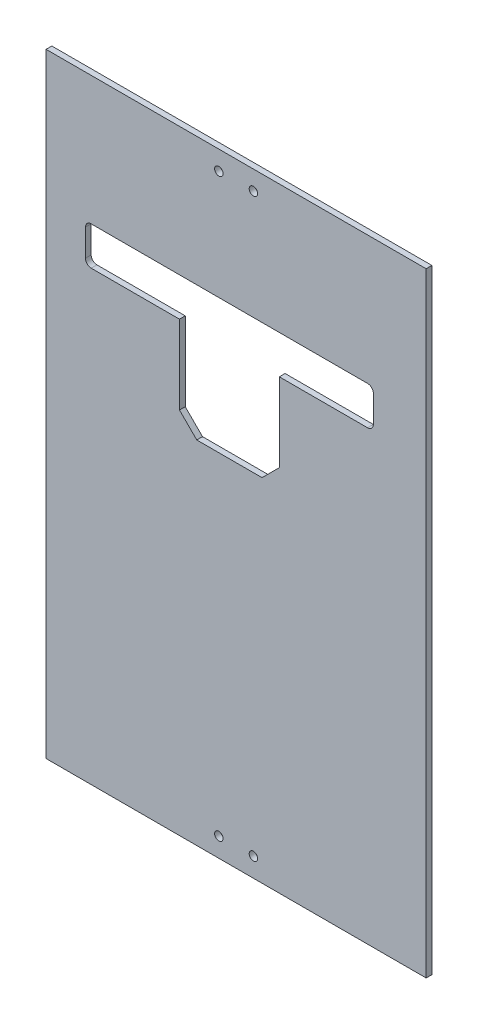
ISO-10303-21;
HEADER;
FILE_DESCRIPTION(('STEP AP214'),'2;1');
FILE_NAME('part.step','',(''),(''),'','','');
FILE_SCHEMA(('AUTOMOTIVE_DESIGN { 1 0 10303 214 1 1 1 1 }'));
ENDSEC;
DATA;
#1=APPLICATION_CONTEXT('core data for automotive mechanical design processes');
#2=APPLICATION_PROTOCOL_DEFINITION('international standard','automotive_design',2000,#1);
#3=PRODUCT_CONTEXT('',#1,'mechanical');
#4=PRODUCT('Part','Part','',(#3));
#5=PRODUCT_RELATED_PRODUCT_CATEGORY('part','',(#4));
#6=PRODUCT_DEFINITION_FORMATION('','',#4);
#7=PRODUCT_DEFINITION_CONTEXT('part definition',#1,'design');
#8=PRODUCT_DEFINITION('design','',#6,#7);
#9=PRODUCT_DEFINITION_SHAPE('','',#8);
#10=(LENGTH_UNIT() NAMED_UNIT(*) SI_UNIT(.MILLI.,.METRE.));
#11=(NAMED_UNIT(*) PLANE_ANGLE_UNIT() SI_UNIT($,.RADIAN.));
#12=(NAMED_UNIT(*) SI_UNIT($,.STERADIAN.) SOLID_ANGLE_UNIT());
#13=UNCERTAINTY_MEASURE_WITH_UNIT(LENGTH_MEASURE(1.E-05),#10,'distance_accuracy_value','');
#14=(GEOMETRIC_REPRESENTATION_CONTEXT(3) GLOBAL_UNCERTAINTY_ASSIGNED_CONTEXT((#13)) GLOBAL_UNIT_ASSIGNED_CONTEXT((#10,
#11,#12)) REPRESENTATION_CONTEXT('',''));
#15=CARTESIAN_POINT('',(0.,0.,0.));
#16=DIRECTION('',(0.,0.,1.));
#17=DIRECTION('',(1.,0.,0.));
#18=AXIS2_PLACEMENT_3D('',#15,#16,#17);
#19=CARTESIAN_POINT('',(-58.5,78.,-0.00100000000000013));
#20=DIRECTION('',(0.,-1.,0.));
#21=DIRECTION('',(1.,0.,0.));
#22=AXIS2_PLACEMENT_3D('',#19,#20,#21);
#23=PLANE('',#22);
#24=DIRECTION('',(1.,0.,0.));
#25=VECTOR('',#24,1.);
#26=CARTESIAN_POINT('',(-58.5,78.,3.));
#27=LINE('',#26,#25);
#28=CARTESIAN_POINT('',(-75.5,78.0000000000001,3.));
#29=VERTEX_POINT('',#28);
#30=CARTESIAN_POINT('',(-29.5,78.,3.));
#31=VERTEX_POINT('',#30);
#32=EDGE_CURVE('E185',#29,#31,#27,.T.);
#33=ORIENTED_EDGE('',*,*,#32,.T.);
#34=DIRECTION('',(0.,0.,1.));
#35=VECTOR('',#34,1.);
#36=CARTESIAN_POINT('',(-29.5,78.,-0.00100000000000013));
#37=LINE('',#36,#35);
#38=CARTESIAN_POINT('',(-29.5,78.,0.));
#39=VERTEX_POINT('',#38);
#40=EDGE_CURVE('E169',#39,#31,#37,.T.);
#41=ORIENTED_EDGE('',*,*,#40,.F.);
#42=DIRECTION('',(1.,0.,0.));
#43=VECTOR('',#42,1.);
#44=CARTESIAN_POINT('',(-58.5,78.,0.));
#45=LINE('',#44,#43);
#46=CARTESIAN_POINT('',(-75.5,78.0000000000001,0.));
#47=VERTEX_POINT('',#46);
#48=EDGE_CURVE('E182',#47,#39,#45,.T.);
#49=ORIENTED_EDGE('',*,*,#48,.F.);
#50=DIRECTION('',(0.,0.,1.));
#51=VECTOR('',#50,1.);
#52=CARTESIAN_POINT('',(-75.5,78.0000000000001,3.));
#53=LINE('',#52,#51);
#54=EDGE_CURVE('E274',#47,#29,#53,.T.);
#55=ORIENTED_EDGE('',*,*,#54,.T.);
#56=EDGE_LOOP('',(#33,#41,#49,#55));
#57=FACE_BOUND('',#56,.T.);
#58=ADVANCED_FACE('F39',(#57),#23,.F.);
#59=CARTESIAN_POINT('',(0.,0.,3.));
#60=DIRECTION('',(0.,0.,-1.));
#61=DIRECTION('',(-1.,0.,0.));
#62=AXIS2_PLACEMENT_3D('',#59,#60,#61);
#63=PLANE('',#62);
#64=DIRECTION('',(0.,-1.,0.));
#65=VECTOR('',#64,1.);
#66=CARTESIAN_POINT('',(-99.,165.,3.));
#67=LINE('',#66,#65);
#68=CARTESIAN_POINT('',(-99.,165.,3.));
#69=VERTEX_POINT('',#68);
#70=CARTESIAN_POINT('',(-99.,-155.,3.));
#71=VERTEX_POINT('',#70);
#72=EDGE_CURVE('E233',#69,#71,#67,.T.);
#73=ORIENTED_EDGE('',*,*,#72,.T.);
#74=DIRECTION('',(1.,0.,0.));
#75=VECTOR('',#74,1.);
#76=CARTESIAN_POINT('',(99.,-155.,3.));
#77=LINE('',#76,#75);
#78=CARTESIAN_POINT('',(99.,-155.,3.));
#79=VERTEX_POINT('',#78);
#80=EDGE_CURVE('E236',#71,#79,#77,.T.);
#81=ORIENTED_EDGE('',*,*,#80,.T.);
#82=DIRECTION('',(0.,1.,0.));
#83=VECTOR('',#82,1.);
#84=CARTESIAN_POINT('',(99.,165.,3.));
#85=LINE('',#84,#83);
#86=CARTESIAN_POINT('',(99.,165.,3.));
#87=VERTEX_POINT('',#86);
#88=EDGE_CURVE('E239',#79,#87,#85,.T.);
#89=ORIENTED_EDGE('',*,*,#88,.T.);
#90=DIRECTION('',(-1.,0.,0.));
#91=VECTOR('',#90,1.);
#92=CARTESIAN_POINT('',(-99.,165.,3.));
#93=LINE('',#92,#91);
#94=EDGE_CURVE('E241',#87,#69,#93,.T.);
#95=ORIENTED_EDGE('',*,*,#94,.T.);
#96=EDGE_LOOP('',(#73,#81,#89,#95));
#97=FACE_BOUND('',#96,.T.);
#98=CARTESIAN_POINT('',(9.,-145.,3.));
#99=DIRECTION('',(0.,0.,1.));
#100=DIRECTION('',(1.,0.,0.));
#101=AXIS2_PLACEMENT_3D('',#98,#99,#100);
#102=CIRCLE('',#101,2.2);
#103=CARTESIAN_POINT('',(11.2,-145.,3.));
#104=VERTEX_POINT('',#103);
#105=EDGE_CURVE('E227',#104,#104,#102,.T.);
#106=ORIENTED_EDGE('',*,*,#105,.F.);
#107=EDGE_LOOP('',(#106));
#108=FACE_BOUND('',#107,.T.);
#109=CARTESIAN_POINT('',(-9.,-145.,3.));
#110=DIRECTION('',(0.,0.,1.));
#111=DIRECTION('',(1.,0.,0.));
#112=AXIS2_PLACEMENT_3D('',#109,#110,#111);
#113=CIRCLE('',#112,2.2);
#114=CARTESIAN_POINT('',(-6.8,-145.,3.));
#115=VERTEX_POINT('',#114);
#116=EDGE_CURVE('E209',#115,#115,#113,.T.);
#117=ORIENTED_EDGE('',*,*,#116,.F.);
#118=EDGE_LOOP('',(#117));
#119=FACE_BOUND('',#118,.T.);
#120=CARTESIAN_POINT('',(-9.,155.,3.));
#121=DIRECTION('',(0.,0.,1.));
#122=DIRECTION('',(1.,0.,0.));
#123=AXIS2_PLACEMENT_3D('',#120,#121,#122);
#124=CIRCLE('',#123,2.2);
#125=CARTESIAN_POINT('',(-6.8,155.,3.));
#126=VERTEX_POINT('',#125);
#127=EDGE_CURVE('E216',#126,#126,#124,.T.);
#128=ORIENTED_EDGE('',*,*,#127,.F.);
#129=EDGE_LOOP('',(#128));
#130=FACE_BOUND('',#129,.T.);
#131=CARTESIAN_POINT('',(9.,155.,3.));
#132=DIRECTION('',(0.,0.,1.));
#133=DIRECTION('',(1.,0.,0.));
#134=AXIS2_PLACEMENT_3D('',#131,#132,#133);
#135=CIRCLE('',#134,2.2);
#136=CARTESIAN_POINT('',(11.2,155.,3.));
#137=VERTEX_POINT('',#136);
#138=EDGE_CURVE('E222',#137,#137,#135,.T.);
#139=ORIENTED_EDGE('',*,*,#138,.F.);
#140=EDGE_LOOP('',(#139));
#141=FACE_BOUND('',#140,.T.);
#142=DIRECTION('',(0.707106781186548,-0.707106781186547,0.));
#143=VECTOR('',#142,1.);
#144=CARTESIAN_POINT('',(-20.5,28.0000000000001,3.));
#145=LINE('',#144,#143);
#146=CARTESIAN_POINT('',(-29.5,37.,3.));
#147=VERTEX_POINT('',#146);
#148=CARTESIAN_POINT('',(-20.5,28.0000000000001,3.));
#149=VERTEX_POINT('',#148);
#150=EDGE_CURVE('E322',#147,#149,#145,.T.);
#151=ORIENTED_EDGE('',*,*,#150,.F.);
#152=DIRECTION('',(0.,-1.,0.));
#153=VECTOR('',#152,1.);
#154=CARTESIAN_POINT('',(-29.5,37.,3.));
#155=LINE('',#154,#153);
#156=EDGE_CURVE('E329',#31,#147,#155,.T.);
#157=ORIENTED_EDGE('',*,*,#156,.F.);
#158=ORIENTED_EDGE('',*,*,#32,.F.);
#159=CARTESIAN_POINT('',(-75.5,81.0000000000001,3.));
#160=DIRECTION('',(0.,0.,-1.));
#161=DIRECTION('',(-1.,0.,0.));
#162=AXIS2_PLACEMENT_3D('',#159,#160,#161);
#163=CIRCLE('',#162,3.);
#164=CARTESIAN_POINT('',(-78.5,81.0000000000001,3.));
#165=VERTEX_POINT('',#164);
#166=EDGE_CURVE('E292',#29,#165,#163,.T.);
#167=ORIENTED_EDGE('',*,*,#166,.T.);
#168=DIRECTION('',(0.,-1.,0.));
#169=VECTOR('',#168,1.);
#170=CARTESIAN_POINT('',(-78.5,78.0000000000001,3.));
#171=LINE('',#170,#169);
#172=CARTESIAN_POINT('',(-78.5,95.0000000000001,3.));
#173=VERTEX_POINT('',#172);
#174=EDGE_CURVE('E196',#173,#165,#171,.T.);
#175=ORIENTED_EDGE('',*,*,#174,.F.);
#176=CARTESIAN_POINT('',(-75.5,95.0000000000001,3.));
#177=DIRECTION('',(0.,0.,-1.));
#178=DIRECTION('',(-1.,0.,0.));
#179=AXIS2_PLACEMENT_3D('',#176,#177,#178);
#180=CIRCLE('',#179,3.);
#181=CARTESIAN_POINT('',(-75.5,98.0000000000001,3.));
#182=VERTEX_POINT('',#181);
#183=EDGE_CURVE('E47',#173,#182,#180,.T.);
#184=ORIENTED_EDGE('',*,*,#183,.T.);
#185=DIRECTION('',(-1.,0.,0.));
#186=VECTOR('',#185,1.);
#187=CARTESIAN_POINT('',(-78.5,98.0000000000001,3.));
#188=LINE('',#187,#186);
#189=CARTESIAN_POINT('',(68.5,98.0000000000001,3.));
#190=VERTEX_POINT('',#189);
#191=EDGE_CURVE('E192',#190,#182,#188,.T.);
#192=ORIENTED_EDGE('',*,*,#191,.F.);
#193=CARTESIAN_POINT('',(68.5,95.0000000000001,3.));
#194=DIRECTION('',(0.,0.,-1.));
#195=DIRECTION('',(-1.,0.,0.));
#196=AXIS2_PLACEMENT_3D('',#193,#194,#195);
#197=CIRCLE('',#196,3.);
#198=CARTESIAN_POINT('',(71.5,95.0000000000001,3.));
#199=VERTEX_POINT('',#198);
#200=EDGE_CURVE('E285',#190,#199,#197,.T.);
#201=ORIENTED_EDGE('',*,*,#200,.T.);
#202=DIRECTION('',(0.,1.,0.));
#203=VECTOR('',#202,1.);
#204=CARTESIAN_POINT('',(71.5,0.,3.));
#205=LINE('',#204,#203);
#206=CARTESIAN_POINT('',(71.5,80.9999999999998,3.));
#207=VERTEX_POINT('',#206);
#208=EDGE_CURVE('E309',#207,#199,#205,.T.);
#209=ORIENTED_EDGE('',*,*,#208,.F.);
#210=CARTESIAN_POINT('',(68.5,80.9999999999998,3.));
#211=DIRECTION('',(0.,0.,-1.));
#212=DIRECTION('',(-1.,0.,0.));
#213=AXIS2_PLACEMENT_3D('',#210,#211,#212);
#214=CIRCLE('',#213,3.);
#215=CARTESIAN_POINT('',(68.5,77.9999999999998,3.));
#216=VERTEX_POINT('',#215);
#217=EDGE_CURVE('E289',#207,#216,#214,.T.);
#218=ORIENTED_EDGE('',*,*,#217,.T.);
#219=CARTESIAN_POINT('',(22.5,77.9999999999999,3.));
#220=VERTEX_POINT('',#219);
#221=EDGE_CURVE('E203',#220,#216,#27,.T.);
#222=ORIENTED_EDGE('',*,*,#221,.F.);
#223=DIRECTION('',(0.,1.,0.));
#224=VECTOR('',#223,1.);
#225=CARTESIAN_POINT('',(22.5,37.0000000000001,3.));
#226=LINE('',#225,#224);
#227=CARTESIAN_POINT('',(22.5,37.0000000000001,3.));
#228=VERTEX_POINT('',#227);
#229=EDGE_CURVE('E54',#228,#220,#226,.T.);
#230=ORIENTED_EDGE('',*,*,#229,.F.);
#231=DIRECTION('',(0.707106781186547,0.707106781186547,0.));
#232=VECTOR('',#231,1.);
#233=CARTESIAN_POINT('',(22.5,37.0000000000001,3.));
#234=LINE('',#233,#232);
#235=CARTESIAN_POINT('',(13.5,28.0000000000001,3.));
#236=VERTEX_POINT('',#235);
#237=EDGE_CURVE('E332',#236,#228,#234,.T.);
#238=ORIENTED_EDGE('',*,*,#237,.F.);
#239=DIRECTION('',(1.,0.,0.));
#240=VECTOR('',#239,1.);
#241=CARTESIAN_POINT('',(-3.49999999999998,28.0000000000001,3.));
#242=LINE('',#241,#240);
#243=EDGE_CURVE('E175',#149,#236,#242,.T.);
#244=ORIENTED_EDGE('',*,*,#243,.F.);
#245=EDGE_LOOP('',(#151,#157,#158,#167,#175,#184,#192,#201,#209,#218,#222,#230,#238,#244));
#246=FACE_BOUND('',#245,.T.);
#247=ADVANCED_FACE('F298',(#97,#108,#119,#130,#141,#246),#63,.F.);
#248=CARTESIAN_POINT('',(0.,0.,0.));
#249=DIRECTION('',(0.,0.,-1.));
#250=DIRECTION('',(-1.,0.,0.));
#251=AXIS2_PLACEMENT_3D('',#248,#249,#250);
#252=PLANE('',#251);
#253=DIRECTION('',(0.,-1.,0.));
#254=VECTOR('',#253,1.);
#255=CARTESIAN_POINT('',(-29.5,37.,0.));
#256=LINE('',#255,#254);
#257=CARTESIAN_POINT('',(-29.5,37.,0.));
#258=VERTEX_POINT('',#257);
#259=EDGE_CURVE('E165',#39,#258,#256,.T.);
#260=ORIENTED_EDGE('',*,*,#259,.T.);
#261=DIRECTION('',(0.707106781186548,-0.707106781186547,0.));
#262=VECTOR('',#261,1.);
#263=CARTESIAN_POINT('',(-20.5,28.0000000000001,0.));
#264=LINE('',#263,#262);
#265=CARTESIAN_POINT('',(-20.5,28.0000000000001,0.));
#266=VERTEX_POINT('',#265);
#267=EDGE_CURVE('E176',#258,#266,#264,.T.);
#268=ORIENTED_EDGE('',*,*,#267,.T.);
#269=DIRECTION('',(1.,0.,0.));
#270=VECTOR('',#269,1.);
#271=CARTESIAN_POINT('',(-3.49999999999998,28.0000000000001,0.));
#272=LINE('',#271,#270);
#273=CARTESIAN_POINT('',(13.5,28.0000000000001,0.));
#274=VERTEX_POINT('',#273);
#275=EDGE_CURVE('E311',#266,#274,#272,.T.);
#276=ORIENTED_EDGE('',*,*,#275,.T.);
#277=DIRECTION('',(0.707106781186548,0.707106781186548,0.));
#278=VECTOR('',#277,1.);
#279=CARTESIAN_POINT('',(22.5,37.0000000000001,0.));
#280=LINE('',#279,#278);
#281=CARTESIAN_POINT('',(22.5,37.0000000000001,0.));
#282=VERTEX_POINT('',#281);
#283=EDGE_CURVE('E341',#274,#282,#280,.T.);
#284=ORIENTED_EDGE('',*,*,#283,.T.);
#285=DIRECTION('',(0.,1.,0.));
#286=VECTOR('',#285,1.);
#287=CARTESIAN_POINT('',(22.5,37.0000000000001,0.));
#288=LINE('',#287,#286);
#289=CARTESIAN_POINT('',(22.5,77.9999999999999,0.));
#290=VERTEX_POINT('',#289);
#291=EDGE_CURVE('E338',#282,#290,#288,.T.);
#292=ORIENTED_EDGE('',*,*,#291,.T.);
#293=CARTESIAN_POINT('',(68.5,77.9999999999998,0.));
#294=VERTEX_POINT('',#293);
#295=EDGE_CURVE('E193',#290,#294,#45,.T.);
#296=ORIENTED_EDGE('',*,*,#295,.T.);
#297=CARTESIAN_POINT('',(68.5,80.9999999999998,0.));
#298=DIRECTION('',(0.,0.,-1.));
#299=DIRECTION('',(-1.,0.,0.));
#300=AXIS2_PLACEMENT_3D('',#297,#298,#299);
#301=CIRCLE('',#300,3.);
#302=CARTESIAN_POINT('',(71.5,80.9999999999998,0.));
#303=VERTEX_POINT('',#302);
#304=EDGE_CURVE('E287',#294,#303,#301,.F.);
#305=ORIENTED_EDGE('',*,*,#304,.T.);
#306=DIRECTION('',(0.,1.,0.));
#307=VECTOR('',#306,1.);
#308=CARTESIAN_POINT('',(71.5,0.,0.));
#309=LINE('',#308,#307);
#310=CARTESIAN_POINT('',(71.5,95.0000000000001,0.));
#311=VERTEX_POINT('',#310);
#312=EDGE_CURVE('E262',#303,#311,#309,.T.);
#313=ORIENTED_EDGE('',*,*,#312,.T.);
#314=CARTESIAN_POINT('',(68.5,95.0000000000001,0.));
#315=DIRECTION('',(0.,0.,-1.));
#316=DIRECTION('',(-1.,0.,0.));
#317=AXIS2_PLACEMENT_3D('',#314,#315,#316);
#318=CIRCLE('',#317,3.);
#319=CARTESIAN_POINT('',(68.5,98.0000000000001,0.));
#320=VERTEX_POINT('',#319);
#321=EDGE_CURVE('E283',#311,#320,#318,.F.);
#322=ORIENTED_EDGE('',*,*,#321,.T.);
#323=DIRECTION('',(-1.,0.,0.));
#324=VECTOR('',#323,1.);
#325=CARTESIAN_POINT('',(-78.5,98.0000000000001,0.));
#326=LINE('',#325,#324);
#327=CARTESIAN_POINT('',(-75.5,98.0000000000001,0.));
#328=VERTEX_POINT('',#327);
#329=EDGE_CURVE('E205',#320,#328,#326,.T.);
#330=ORIENTED_EDGE('',*,*,#329,.T.);
#331=CARTESIAN_POINT('',(-75.5,95.0000000000001,0.));
#332=DIRECTION('',(0.,0.,-1.));
#333=DIRECTION('',(-1.,0.,0.));
#334=AXIS2_PLACEMENT_3D('',#331,#332,#333);
#335=CIRCLE('',#334,3.);
#336=CARTESIAN_POINT('',(-78.5,95.0000000000001,0.));
#337=VERTEX_POINT('',#336);
#338=EDGE_CURVE('E11',#328,#337,#335,.F.);
#339=ORIENTED_EDGE('',*,*,#338,.T.);
#340=DIRECTION('',(0.,-1.,0.));
#341=VECTOR('',#340,1.);
#342=CARTESIAN_POINT('',(-78.5,78.0000000000001,0.));
#343=LINE('',#342,#341);
#344=CARTESIAN_POINT('',(-78.5,81.0000000000001,0.));
#345=VERTEX_POINT('',#344);
#346=EDGE_CURVE('E198',#337,#345,#343,.T.);
#347=ORIENTED_EDGE('',*,*,#346,.T.);
#348=CARTESIAN_POINT('',(-75.5,81.0000000000001,0.));
#349=DIRECTION('',(0.,0.,-1.));
#350=DIRECTION('',(-1.,0.,0.));
#351=AXIS2_PLACEMENT_3D('',#348,#349,#350);
#352=CIRCLE('',#351,3.);
#353=EDGE_CURVE('E191',#345,#47,#352,.F.);
#354=ORIENTED_EDGE('',*,*,#353,.T.);
#355=ORIENTED_EDGE('',*,*,#48,.T.);
#356=EDGE_LOOP('',(#260,#268,#276,#284,#292,#296,#305,#313,#322,#330,#339,#347,#354,#355));
#357=FACE_BOUND('',#356,.T.);
#358=CARTESIAN_POINT('',(9.,155.,0.));
#359=DIRECTION('',(0.,0.,-1.));
#360=DIRECTION('',(-1.,0.,0.));
#361=AXIS2_PLACEMENT_3D('',#358,#359,#360);
#362=CIRCLE('',#361,2.2);
#363=CARTESIAN_POINT('',(11.2,155.,0.));
#364=VERTEX_POINT('',#363);
#365=EDGE_CURVE('E208',#364,#364,#362,.F.);
#366=ORIENTED_EDGE('',*,*,#365,.T.);
#367=EDGE_LOOP('',(#366));
#368=FACE_BOUND('',#367,.T.);
#369=CARTESIAN_POINT('',(-9.,155.,0.));
#370=DIRECTION('',(0.,0.,-1.));
#371=DIRECTION('',(-1.,0.,0.));
#372=AXIS2_PLACEMENT_3D('',#369,#370,#371);
#373=CIRCLE('',#372,2.2);
#374=CARTESIAN_POINT('',(-6.8,155.,0.));
#375=VERTEX_POINT('',#374);
#376=EDGE_CURVE('E219',#375,#375,#373,.F.);
#377=ORIENTED_EDGE('',*,*,#376,.T.);
#378=EDGE_LOOP('',(#377));
#379=FACE_BOUND('',#378,.T.);
#380=CARTESIAN_POINT('',(-9.,-145.,0.));
#381=DIRECTION('',(0.,0.,-1.));
#382=DIRECTION('',(-1.,0.,0.));
#383=AXIS2_PLACEMENT_3D('',#380,#381,#382);
#384=CIRCLE('',#383,2.2);
#385=CARTESIAN_POINT('',(-6.8,-145.,0.));
#386=VERTEX_POINT('',#385);
#387=EDGE_CURVE('E213',#386,#386,#384,.F.);
#388=ORIENTED_EDGE('',*,*,#387,.T.);
#389=EDGE_LOOP('',(#388));
#390=FACE_BOUND('',#389,.T.);
#391=CARTESIAN_POINT('',(9.,-145.,0.));
#392=DIRECTION('',(0.,0.,-1.));
#393=DIRECTION('',(-1.,0.,0.));
#394=AXIS2_PLACEMENT_3D('',#391,#392,#393);
#395=CIRCLE('',#394,2.2);
#396=CARTESIAN_POINT('',(11.2,-145.,0.));
#397=VERTEX_POINT('',#396);
#398=EDGE_CURVE('E212',#397,#397,#395,.F.);
#399=ORIENTED_EDGE('',*,*,#398,.T.);
#400=EDGE_LOOP('',(#399));
#401=FACE_BOUND('',#400,.T.);
#402=DIRECTION('',(0.,-1.,0.));
#403=VECTOR('',#402,1.);
#404=CARTESIAN_POINT('',(-99.,165.,0.));
#405=LINE('',#404,#403);
#406=CARTESIAN_POINT('',(-99.,165.,0.));
#407=VERTEX_POINT('',#406);
#408=CARTESIAN_POINT('',(-99.,-155.,0.));
#409=VERTEX_POINT('',#408);
#410=EDGE_CURVE('E230',#407,#409,#405,.T.);
#411=ORIENTED_EDGE('',*,*,#410,.F.);
#412=DIRECTION('',(-1.,0.,0.));
#413=VECTOR('',#412,1.);
#414=CARTESIAN_POINT('',(-99.,165.,0.));
#415=LINE('',#414,#413);
#416=CARTESIAN_POINT('',(99.,165.,0.));
#417=VERTEX_POINT('',#416);
#418=EDGE_CURVE('E237',#417,#407,#415,.T.);
#419=ORIENTED_EDGE('',*,*,#418,.F.);
#420=DIRECTION('',(0.,1.,0.));
#421=VECTOR('',#420,1.);
#422=CARTESIAN_POINT('',(99.,165.,0.));
#423=LINE('',#422,#421);
#424=CARTESIAN_POINT('',(99.,-155.,0.));
#425=VERTEX_POINT('',#424);
#426=EDGE_CURVE('E248',#425,#417,#423,.T.);
#427=ORIENTED_EDGE('',*,*,#426,.F.);
#428=DIRECTION('',(1.,0.,0.));
#429=VECTOR('',#428,1.);
#430=CARTESIAN_POINT('',(99.,-155.,0.));
#431=LINE('',#430,#429);
#432=EDGE_CURVE('E246',#409,#425,#431,.T.);
#433=ORIENTED_EDGE('',*,*,#432,.F.);
#434=EDGE_LOOP('',(#411,#419,#427,#433));
#435=FACE_BOUND('',#434,.T.);
#436=ADVANCED_FACE('F188',(#357,#368,#379,#390,#401,#435),#252,.T.);
#437=CARTESIAN_POINT('',(-99.,165.,3.));
#438=DIRECTION('',(1.,0.,0.));
#439=DIRECTION('',(0.,1.,0.));
#440=AXIS2_PLACEMENT_3D('',#437,#438,#439);
#441=PLANE('',#440);
#442=ORIENTED_EDGE('',*,*,#410,.T.);
#443=DIRECTION('',(0.,0.,-1.));
#444=VECTOR('',#443,1.);
#445=CARTESIAN_POINT('',(-99.,-155.,3.));
#446=LINE('',#445,#444);
#447=EDGE_CURVE('E259',#71,#409,#446,.T.);
#448=ORIENTED_EDGE('',*,*,#447,.F.);
#449=ORIENTED_EDGE('',*,*,#72,.F.);
#450=DIRECTION('',(0.,0.,-1.));
#451=VECTOR('',#450,1.);
#452=CARTESIAN_POINT('',(-99.,165.,3.));
#453=LINE('',#452,#451);
#454=EDGE_CURVE('E243',#69,#407,#453,.T.);
#455=ORIENTED_EDGE('',*,*,#454,.T.);
#456=EDGE_LOOP('',(#442,#448,#449,#455));
#457=FACE_BOUND('',#456,.T.);
#458=ADVANCED_FACE('F403',(#457),#441,.F.);
#459=CARTESIAN_POINT('',(99.,-155.,3.));
#460=DIRECTION('',(0.,1.,0.));
#461=DIRECTION('',(-1.,0.,0.));
#462=AXIS2_PLACEMENT_3D('',#459,#460,#461);
#463=PLANE('',#462);
#464=ORIENTED_EDGE('',*,*,#432,.T.);
#465=DIRECTION('',(0.,0.,-1.));
#466=VECTOR('',#465,1.);
#467=CARTESIAN_POINT('',(99.,-155.,3.));
#468=LINE('',#467,#466);
#469=EDGE_CURVE('E256',#79,#425,#468,.T.);
#470=ORIENTED_EDGE('',*,*,#469,.F.);
#471=ORIENTED_EDGE('',*,*,#80,.F.);
#472=ORIENTED_EDGE('',*,*,#447,.T.);
#473=EDGE_LOOP('',(#464,#470,#471,#472));
#474=FACE_BOUND('',#473,.T.);
#475=ADVANCED_FACE('F410',(#474),#463,.F.);
#476=CARTESIAN_POINT('',(99.,165.,3.));
#477=DIRECTION('',(-1.,0.,0.));
#478=DIRECTION('',(0.,-1.,0.));
#479=AXIS2_PLACEMENT_3D('',#476,#477,#478);
#480=PLANE('',#479);
#481=ORIENTED_EDGE('',*,*,#426,.T.);
#482=DIRECTION('',(0.,0.,-1.));
#483=VECTOR('',#482,1.);
#484=CARTESIAN_POINT('',(99.,165.,3.));
#485=LINE('',#484,#483);
#486=EDGE_CURVE('E253',#87,#417,#485,.T.);
#487=ORIENTED_EDGE('',*,*,#486,.F.);
#488=ORIENTED_EDGE('',*,*,#88,.F.);
#489=ORIENTED_EDGE('',*,*,#469,.T.);
#490=EDGE_LOOP('',(#481,#487,#488,#489));
#491=FACE_BOUND('',#490,.T.);
#492=ADVANCED_FACE('F406',(#491),#480,.F.);
#493=CARTESIAN_POINT('',(-99.,165.,3.));
#494=DIRECTION('',(0.,-1.,0.));
#495=DIRECTION('',(0.,0.,-1.));
#496=AXIS2_PLACEMENT_3D('',#493,#494,#495);
#497=PLANE('',#496);
#498=ORIENTED_EDGE('',*,*,#418,.T.);
#499=ORIENTED_EDGE('',*,*,#454,.F.);
#500=ORIENTED_EDGE('',*,*,#94,.F.);
#501=ORIENTED_EDGE('',*,*,#486,.T.);
#502=EDGE_LOOP('',(#498,#499,#500,#501));
#503=FACE_BOUND('',#502,.T.);
#504=ADVANCED_FACE('F398',(#503),#497,.F.);
#505=CARTESIAN_POINT('',(9.,-145.,-0.00100000000000013));
#506=DIRECTION('',(0.,0.,1.));
#507=DIRECTION('',(1.,0.,0.));
#508=AXIS2_PLACEMENT_3D('',#505,#506,#507);
#509=CYLINDRICAL_SURFACE('',#508,2.2);
#510=CARTESIAN_POINT('',(11.2,-145.,0.));
#511=CARTESIAN_POINT('',(11.2,-145.,0.03125));
#512=CARTESIAN_POINT('',(11.2,-145.,0.0625));
#513=CARTESIAN_POINT('',(11.2,-145.,0.125));
#514=CARTESIAN_POINT('',(11.2,-145.,0.15625));
#515=CARTESIAN_POINT('',(11.2,-145.,0.21875));
#516=CARTESIAN_POINT('',(11.2,-145.,0.25));
#517=CARTESIAN_POINT('',(11.2,-145.,0.3125));
#518=CARTESIAN_POINT('',(11.2,-145.,0.34375));
#519=CARTESIAN_POINT('',(11.2,-145.,0.40625));
#520=CARTESIAN_POINT('',(11.2,-145.,0.4375));
#521=CARTESIAN_POINT('',(11.2,-145.,0.5));
#522=CARTESIAN_POINT('',(11.2,-145.,0.53125));
#523=CARTESIAN_POINT('',(11.2,-145.,0.59375));
#524=CARTESIAN_POINT('',(11.2,-145.,0.625));
#525=CARTESIAN_POINT('',(11.2,-145.,0.6875));
#526=CARTESIAN_POINT('',(11.2,-145.,0.71875));
#527=CARTESIAN_POINT('',(11.2,-145.,0.78125));
#528=CARTESIAN_POINT('',(11.2,-145.,0.8125));
#529=CARTESIAN_POINT('',(11.2,-145.,0.875));
#530=CARTESIAN_POINT('',(11.2,-145.,0.90625));
#531=CARTESIAN_POINT('',(11.2,-145.,0.96875));
#532=CARTESIAN_POINT('',(11.2,-145.,1.));
#533=CARTESIAN_POINT('',(11.2,-145.,1.0625));
#534=CARTESIAN_POINT('',(11.2,-145.,1.09375));
#535=CARTESIAN_POINT('',(11.2,-145.,1.15625));
#536=CARTESIAN_POINT('',(11.2,-145.,1.1875));
#537=CARTESIAN_POINT('',(11.2,-145.,1.25));
#538=CARTESIAN_POINT('',(11.2,-145.,1.28125));
#539=CARTESIAN_POINT('',(11.2,-145.,1.34375));
#540=CARTESIAN_POINT('',(11.2,-145.,1.375));
#541=CARTESIAN_POINT('',(11.2,-145.,1.4375));
#542=CARTESIAN_POINT('',(11.2,-145.,1.46875));
#543=CARTESIAN_POINT('',(11.2,-145.,1.53125));
#544=CARTESIAN_POINT('',(11.2,-145.,1.5625));
#545=CARTESIAN_POINT('',(11.2,-145.,1.625));
#546=CARTESIAN_POINT('',(11.2,-145.,1.65625));
#547=CARTESIAN_POINT('',(11.2,-145.,1.71875));
#548=CARTESIAN_POINT('',(11.2,-145.,1.75));
#549=CARTESIAN_POINT('',(11.2,-145.,1.8125));
#550=CARTESIAN_POINT('',(11.2,-145.,1.84375));
#551=CARTESIAN_POINT('',(11.2,-145.,1.90625));
#552=CARTESIAN_POINT('',(11.2,-145.,1.9375));
#553=CARTESIAN_POINT('',(11.2,-145.,2.));
#554=CARTESIAN_POINT('',(11.2,-145.,2.03125));
#555=CARTESIAN_POINT('',(11.2,-145.,2.09375));
#556=CARTESIAN_POINT('',(11.2,-145.,2.125));
#557=CARTESIAN_POINT('',(11.2,-145.,2.1875));
#558=CARTESIAN_POINT('',(11.2,-145.,2.21875));
#559=CARTESIAN_POINT('',(11.2,-145.,2.28125));
#560=CARTESIAN_POINT('',(11.2,-145.,2.3125));
#561=CARTESIAN_POINT('',(11.2,-145.,2.375));
#562=CARTESIAN_POINT('',(11.2,-145.,2.40625));
#563=CARTESIAN_POINT('',(11.2,-145.,2.46875));
#564=CARTESIAN_POINT('',(11.2,-145.,2.5));
#565=CARTESIAN_POINT('',(11.2,-145.,2.5625));
#566=CARTESIAN_POINT('',(11.2,-145.,2.59375));
#567=CARTESIAN_POINT('',(11.2,-145.,2.65625));
#568=CARTESIAN_POINT('',(11.2,-145.,2.6875));
#569=CARTESIAN_POINT('',(11.2,-145.,2.75));
#570=CARTESIAN_POINT('',(11.2,-145.,2.78125));
#571=CARTESIAN_POINT('',(11.2,-145.,2.84375));
#572=CARTESIAN_POINT('',(11.2,-145.,2.875));
#573=CARTESIAN_POINT('',(11.2,-145.,2.9375));
#574=CARTESIAN_POINT('',(11.2,-145.,2.96875));
#575=CARTESIAN_POINT('',(11.2,-145.,3.));
#576=B_SPLINE_CURVE_WITH_KNOTS('',3,(#510,#511,#512,#513,#514,#515,#516,#517,#518,#519,#520,
#521,#522,#523,#524,#525,#526,#527,#528,#529,#530,#531,#532,#533,#534,#535,#536,#537,#538,#539,
#540,#541,#542,#543,#544,#545,#546,#547,#548,#549,#550,#551,#552,#553,#554,#555,#556,#557,#558,
#559,#560,#561,#562,#563,#564,#565,#566,#567,#568,#569,#570,#571,#572,#573,#574,#575),
.UNSPECIFIED.,.F.,.F.,(4,2,2,2,2,2,2,2,2,2,2,2,2,2,2,2,2,2,2,2,2,2,2,2,2,2,2,2,2,2,2,2,4),(0.,
0.09375,0.1875,0.28125,0.375,0.46875,0.5625,0.65625,0.75,0.84375,0.9375,1.03125,1.125,1.21875,
1.3125,1.40625,1.5,1.59375,1.6875,1.78125,1.875,1.96875,2.0625,2.15625,2.25,2.34375,2.4375,
2.53125,2.625,2.71875,2.8125,2.90625,3.),.UNSPECIFIED.);
#577=EDGE_CURVE('BSEAM396',#397,#104,#576,.T.);
#578=ORIENTED_EDGE('',*,*,#398,.F.);
#579=ORIENTED_EDGE('',*,*,#105,.T.);
#580=ORIENTED_EDGE('',*,*,#577,.T.);
#581=ORIENTED_EDGE('',*,*,#577,.F.);
#582=EDGE_LOOP('',(#578,#580,#579,#581));
#583=FACE_BOUND('',#582,.T.);
#584=ADVANCED_FACE('F396',(#583),#509,.F.);
#585=CARTESIAN_POINT('',(-9.,-145.,-0.00100000000000013));
#586=DIRECTION('',(0.,0.,1.));
#587=DIRECTION('',(1.,0.,0.));
#588=AXIS2_PLACEMENT_3D('',#585,#586,#587);
#589=CYLINDRICAL_SURFACE('',#588,2.2);
#590=CARTESIAN_POINT('',(-6.8,-145.,0.));
#591=CARTESIAN_POINT('',(-6.8,-145.,0.03125));
#592=CARTESIAN_POINT('',(-6.8,-145.,0.0625));
#593=CARTESIAN_POINT('',(-6.8,-145.,0.125));
#594=CARTESIAN_POINT('',(-6.8,-145.,0.15625));
#595=CARTESIAN_POINT('',(-6.8,-145.,0.21875));
#596=CARTESIAN_POINT('',(-6.8,-145.,0.25));
#597=CARTESIAN_POINT('',(-6.8,-145.,0.3125));
#598=CARTESIAN_POINT('',(-6.8,-145.,0.34375));
#599=CARTESIAN_POINT('',(-6.8,-145.,0.40625));
#600=CARTESIAN_POINT('',(-6.8,-145.,0.4375));
#601=CARTESIAN_POINT('',(-6.8,-145.,0.5));
#602=CARTESIAN_POINT('',(-6.8,-145.,0.53125));
#603=CARTESIAN_POINT('',(-6.8,-145.,0.59375));
#604=CARTESIAN_POINT('',(-6.8,-145.,0.625));
#605=CARTESIAN_POINT('',(-6.8,-145.,0.6875));
#606=CARTESIAN_POINT('',(-6.8,-145.,0.71875));
#607=CARTESIAN_POINT('',(-6.8,-145.,0.78125));
#608=CARTESIAN_POINT('',(-6.8,-145.,0.8125));
#609=CARTESIAN_POINT('',(-6.8,-145.,0.875));
#610=CARTESIAN_POINT('',(-6.8,-145.,0.90625));
#611=CARTESIAN_POINT('',(-6.8,-145.,0.96875));
#612=CARTESIAN_POINT('',(-6.8,-145.,1.));
#613=CARTESIAN_POINT('',(-6.8,-145.,1.0625));
#614=CARTESIAN_POINT('',(-6.8,-145.,1.09375));
#615=CARTESIAN_POINT('',(-6.8,-145.,1.15625));
#616=CARTESIAN_POINT('',(-6.8,-145.,1.1875));
#617=CARTESIAN_POINT('',(-6.8,-145.,1.25));
#618=CARTESIAN_POINT('',(-6.8,-145.,1.28125));
#619=CARTESIAN_POINT('',(-6.8,-145.,1.34375));
#620=CARTESIAN_POINT('',(-6.8,-145.,1.375));
#621=CARTESIAN_POINT('',(-6.8,-145.,1.4375));
#622=CARTESIAN_POINT('',(-6.8,-145.,1.46875));
#623=CARTESIAN_POINT('',(-6.8,-145.,1.53125));
#624=CARTESIAN_POINT('',(-6.8,-145.,1.5625));
#625=CARTESIAN_POINT('',(-6.8,-145.,1.625));
#626=CARTESIAN_POINT('',(-6.8,-145.,1.65625));
#627=CARTESIAN_POINT('',(-6.8,-145.,1.71875));
#628=CARTESIAN_POINT('',(-6.8,-145.,1.75));
#629=CARTESIAN_POINT('',(-6.8,-145.,1.8125));
#630=CARTESIAN_POINT('',(-6.8,-145.,1.84375));
#631=CARTESIAN_POINT('',(-6.8,-145.,1.90625));
#632=CARTESIAN_POINT('',(-6.8,-145.,1.9375));
#633=CARTESIAN_POINT('',(-6.8,-145.,2.));
#634=CARTESIAN_POINT('',(-6.8,-145.,2.03125));
#635=CARTESIAN_POINT('',(-6.8,-145.,2.09375));
#636=CARTESIAN_POINT('',(-6.8,-145.,2.125));
#637=CARTESIAN_POINT('',(-6.8,-145.,2.1875));
#638=CARTESIAN_POINT('',(-6.8,-145.,2.21875));
#639=CARTESIAN_POINT('',(-6.8,-145.,2.28125));
#640=CARTESIAN_POINT('',(-6.8,-145.,2.3125));
#641=CARTESIAN_POINT('',(-6.8,-145.,2.375));
#642=CARTESIAN_POINT('',(-6.8,-145.,2.40625));
#643=CARTESIAN_POINT('',(-6.8,-145.,2.46875));
#644=CARTESIAN_POINT('',(-6.8,-145.,2.5));
#645=CARTESIAN_POINT('',(-6.8,-145.,2.5625));
#646=CARTESIAN_POINT('',(-6.8,-145.,2.59375));
#647=CARTESIAN_POINT('',(-6.8,-145.,2.65625));
#648=CARTESIAN_POINT('',(-6.8,-145.,2.6875));
#649=CARTESIAN_POINT('',(-6.8,-145.,2.75));
#650=CARTESIAN_POINT('',(-6.8,-145.,2.78125));
#651=CARTESIAN_POINT('',(-6.8,-145.,2.84375));
#652=CARTESIAN_POINT('',(-6.8,-145.,2.875));
#653=CARTESIAN_POINT('',(-6.8,-145.,2.9375));
#654=CARTESIAN_POINT('',(-6.8,-145.,2.96875));
#655=CARTESIAN_POINT('',(-6.8,-145.,3.));
#656=B_SPLINE_CURVE_WITH_KNOTS('',3,(#590,#591,#592,#593,#594,#595,#596,#597,#598,#599,#600,
#601,#602,#603,#604,#605,#606,#607,#608,#609,#610,#611,#612,#613,#614,#615,#616,#617,#618,#619,
#620,#621,#622,#623,#624,#625,#626,#627,#628,#629,#630,#631,#632,#633,#634,#635,#636,#637,#638,
#639,#640,#641,#642,#643,#644,#645,#646,#647,#648,#649,#650,#651,#652,#653,#654,#655),
.UNSPECIFIED.,.F.,.F.,(4,2,2,2,2,2,2,2,2,2,2,2,2,2,2,2,2,2,2,2,2,2,2,2,2,2,2,2,2,2,2,2,4),(0.,
0.09375,0.1875,0.28125,0.375,0.46875,0.5625,0.65625,0.75,0.84375,0.9375,1.03125,1.125,1.21875,
1.3125,1.40625,1.5,1.59375,1.6875,1.78125,1.875,1.96875,2.0625,2.15625,2.25,2.34375,2.4375,
2.53125,2.625,2.71875,2.8125,2.90625,3.),.UNSPECIFIED.);
#657=EDGE_CURVE('BSEAM389',#386,#115,#656,.T.);
#658=ORIENTED_EDGE('',*,*,#387,.F.);
#659=ORIENTED_EDGE('',*,*,#116,.T.);
#660=ORIENTED_EDGE('',*,*,#657,.T.);
#661=ORIENTED_EDGE('',*,*,#657,.F.);
#662=EDGE_LOOP('',(#658,#660,#659,#661));
#663=FACE_BOUND('',#662,.T.);
#664=ADVANCED_FACE('F389',(#663),#589,.F.);
#665=CARTESIAN_POINT('',(-9.,155.,-0.00100000000000013));
#666=DIRECTION('',(0.,0.,1.));
#667=DIRECTION('',(1.,0.,0.));
#668=AXIS2_PLACEMENT_3D('',#665,#666,#667);
#669=CYLINDRICAL_SURFACE('',#668,2.2);
#670=CARTESIAN_POINT('',(-6.8,155.,0.));
#671=CARTESIAN_POINT('',(-6.8,155.,0.03125));
#672=CARTESIAN_POINT('',(-6.8,155.,0.0625));
#673=CARTESIAN_POINT('',(-6.8,155.,0.125));
#674=CARTESIAN_POINT('',(-6.8,155.,0.15625));
#675=CARTESIAN_POINT('',(-6.8,155.,0.21875));
#676=CARTESIAN_POINT('',(-6.8,155.,0.25));
#677=CARTESIAN_POINT('',(-6.8,155.,0.3125));
#678=CARTESIAN_POINT('',(-6.8,155.,0.34375));
#679=CARTESIAN_POINT('',(-6.8,155.,0.40625));
#680=CARTESIAN_POINT('',(-6.8,155.,0.4375));
#681=CARTESIAN_POINT('',(-6.8,155.,0.5));
#682=CARTESIAN_POINT('',(-6.8,155.,0.53125));
#683=CARTESIAN_POINT('',(-6.8,155.,0.59375));
#684=CARTESIAN_POINT('',(-6.8,155.,0.625));
#685=CARTESIAN_POINT('',(-6.8,155.,0.6875));
#686=CARTESIAN_POINT('',(-6.8,155.,0.71875));
#687=CARTESIAN_POINT('',(-6.8,155.,0.78125));
#688=CARTESIAN_POINT('',(-6.8,155.,0.8125));
#689=CARTESIAN_POINT('',(-6.8,155.,0.875));
#690=CARTESIAN_POINT('',(-6.8,155.,0.90625));
#691=CARTESIAN_POINT('',(-6.8,155.,0.96875));
#692=CARTESIAN_POINT('',(-6.8,155.,1.));
#693=CARTESIAN_POINT('',(-6.8,155.,1.0625));
#694=CARTESIAN_POINT('',(-6.8,155.,1.09375));
#695=CARTESIAN_POINT('',(-6.8,155.,1.15625));
#696=CARTESIAN_POINT('',(-6.8,155.,1.1875));
#697=CARTESIAN_POINT('',(-6.8,155.,1.25));
#698=CARTESIAN_POINT('',(-6.8,155.,1.28125));
#699=CARTESIAN_POINT('',(-6.8,155.,1.34375));
#700=CARTESIAN_POINT('',(-6.8,155.,1.375));
#701=CARTESIAN_POINT('',(-6.8,155.,1.4375));
#702=CARTESIAN_POINT('',(-6.8,155.,1.46875));
#703=CARTESIAN_POINT('',(-6.8,155.,1.53125));
#704=CARTESIAN_POINT('',(-6.8,155.,1.5625));
#705=CARTESIAN_POINT('',(-6.8,155.,1.625));
#706=CARTESIAN_POINT('',(-6.8,155.,1.65625));
#707=CARTESIAN_POINT('',(-6.8,155.,1.71875));
#708=CARTESIAN_POINT('',(-6.8,155.,1.75));
#709=CARTESIAN_POINT('',(-6.8,155.,1.8125));
#710=CARTESIAN_POINT('',(-6.8,155.,1.84375));
#711=CARTESIAN_POINT('',(-6.8,155.,1.90625));
#712=CARTESIAN_POINT('',(-6.8,155.,1.9375));
#713=CARTESIAN_POINT('',(-6.8,155.,2.));
#714=CARTESIAN_POINT('',(-6.8,155.,2.03125));
#715=CARTESIAN_POINT('',(-6.8,155.,2.09375));
#716=CARTESIAN_POINT('',(-6.8,155.,2.125));
#717=CARTESIAN_POINT('',(-6.8,155.,2.1875));
#718=CARTESIAN_POINT('',(-6.8,155.,2.21875));
#719=CARTESIAN_POINT('',(-6.8,155.,2.28125));
#720=CARTESIAN_POINT('',(-6.8,155.,2.3125));
#721=CARTESIAN_POINT('',(-6.8,155.,2.375));
#722=CARTESIAN_POINT('',(-6.8,155.,2.40625));
#723=CARTESIAN_POINT('',(-6.8,155.,2.46875));
#724=CARTESIAN_POINT('',(-6.8,155.,2.5));
#725=CARTESIAN_POINT('',(-6.8,155.,2.5625));
#726=CARTESIAN_POINT('',(-6.8,155.,2.59375));
#727=CARTESIAN_POINT('',(-6.8,155.,2.65625));
#728=CARTESIAN_POINT('',(-6.8,155.,2.6875));
#729=CARTESIAN_POINT('',(-6.8,155.,2.75));
#730=CARTESIAN_POINT('',(-6.8,155.,2.78125));
#731=CARTESIAN_POINT('',(-6.8,155.,2.84375));
#732=CARTESIAN_POINT('',(-6.8,155.,2.875));
#733=CARTESIAN_POINT('',(-6.8,155.,2.9375));
#734=CARTESIAN_POINT('',(-6.8,155.,2.96875));
#735=CARTESIAN_POINT('',(-6.8,155.,3.));
#736=B_SPLINE_CURVE_WITH_KNOTS('',3,(#670,#671,#672,#673,#674,#675,#676,#677,#678,#679,#680,
#681,#682,#683,#684,#685,#686,#687,#688,#689,#690,#691,#692,#693,#694,#695,#696,#697,#698,#699,
#700,#701,#702,#703,#704,#705,#706,#707,#708,#709,#710,#711,#712,#713,#714,#715,#716,#717,#718,
#719,#720,#721,#722,#723,#724,#725,#726,#727,#728,#729,#730,#731,#732,#733,#734,#735),
.UNSPECIFIED.,.F.,.F.,(4,2,2,2,2,2,2,2,2,2,2,2,2,2,2,2,2,2,2,2,2,2,2,2,2,2,2,2,2,2,2,2,4),(0.,
0.09375,0.1875,0.28125,0.375,0.46875,0.5625,0.65625,0.75,0.84375,0.9375,1.03125,1.125,1.21875,
1.3125,1.40625,1.5,1.59375,1.6875,1.78125,1.875,1.96875,2.0625,2.15625,2.25,2.34375,2.4375,
2.53125,2.625,2.71875,2.8125,2.90625,3.),.UNSPECIFIED.);
#737=EDGE_CURVE('BSEAM383',#375,#126,#736,.T.);
#738=ORIENTED_EDGE('',*,*,#376,.F.);
#739=ORIENTED_EDGE('',*,*,#127,.T.);
#740=ORIENTED_EDGE('',*,*,#737,.T.);
#741=ORIENTED_EDGE('',*,*,#737,.F.);
#742=EDGE_LOOP('',(#738,#740,#739,#741));
#743=FACE_BOUND('',#742,.T.);
#744=ADVANCED_FACE('F383',(#743),#669,.F.);
#745=CARTESIAN_POINT('',(9.,155.,-0.00100000000000013));
#746=DIRECTION('',(0.,0.,1.));
#747=DIRECTION('',(1.,0.,0.));
#748=AXIS2_PLACEMENT_3D('',#745,#746,#747);
#749=CYLINDRICAL_SURFACE('',#748,2.2);
#750=CARTESIAN_POINT('',(11.2,155.,0.));
#751=CARTESIAN_POINT('',(11.2,155.,0.03125));
#752=CARTESIAN_POINT('',(11.2,155.,0.0625));
#753=CARTESIAN_POINT('',(11.2,155.,0.125));
#754=CARTESIAN_POINT('',(11.2,155.,0.15625));
#755=CARTESIAN_POINT('',(11.2,155.,0.21875));
#756=CARTESIAN_POINT('',(11.2,155.,0.25));
#757=CARTESIAN_POINT('',(11.2,155.,0.3125));
#758=CARTESIAN_POINT('',(11.2,155.,0.34375));
#759=CARTESIAN_POINT('',(11.2,155.,0.40625));
#760=CARTESIAN_POINT('',(11.2,155.,0.4375));
#761=CARTESIAN_POINT('',(11.2,155.,0.5));
#762=CARTESIAN_POINT('',(11.2,155.,0.53125));
#763=CARTESIAN_POINT('',(11.2,155.,0.59375));
#764=CARTESIAN_POINT('',(11.2,155.,0.625));
#765=CARTESIAN_POINT('',(11.2,155.,0.6875));
#766=CARTESIAN_POINT('',(11.2,155.,0.71875));
#767=CARTESIAN_POINT('',(11.2,155.,0.78125));
#768=CARTESIAN_POINT('',(11.2,155.,0.8125));
#769=CARTESIAN_POINT('',(11.2,155.,0.875));
#770=CARTESIAN_POINT('',(11.2,155.,0.90625));
#771=CARTESIAN_POINT('',(11.2,155.,0.96875));
#772=CARTESIAN_POINT('',(11.2,155.,1.));
#773=CARTESIAN_POINT('',(11.2,155.,1.0625));
#774=CARTESIAN_POINT('',(11.2,155.,1.09375));
#775=CARTESIAN_POINT('',(11.2,155.,1.15625));
#776=CARTESIAN_POINT('',(11.2,155.,1.1875));
#777=CARTESIAN_POINT('',(11.2,155.,1.25));
#778=CARTESIAN_POINT('',(11.2,155.,1.28125));
#779=CARTESIAN_POINT('',(11.2,155.,1.34375));
#780=CARTESIAN_POINT('',(11.2,155.,1.375));
#781=CARTESIAN_POINT('',(11.2,155.,1.4375));
#782=CARTESIAN_POINT('',(11.2,155.,1.46875));
#783=CARTESIAN_POINT('',(11.2,155.,1.53125));
#784=CARTESIAN_POINT('',(11.2,155.,1.5625));
#785=CARTESIAN_POINT('',(11.2,155.,1.625));
#786=CARTESIAN_POINT('',(11.2,155.,1.65625));
#787=CARTESIAN_POINT('',(11.2,155.,1.71875));
#788=CARTESIAN_POINT('',(11.2,155.,1.75));
#789=CARTESIAN_POINT('',(11.2,155.,1.8125));
#790=CARTESIAN_POINT('',(11.2,155.,1.84375));
#791=CARTESIAN_POINT('',(11.2,155.,1.90625));
#792=CARTESIAN_POINT('',(11.2,155.,1.9375));
#793=CARTESIAN_POINT('',(11.2,155.,2.));
#794=CARTESIAN_POINT('',(11.2,155.,2.03125));
#795=CARTESIAN_POINT('',(11.2,155.,2.09375));
#796=CARTESIAN_POINT('',(11.2,155.,2.125));
#797=CARTESIAN_POINT('',(11.2,155.,2.1875));
#798=CARTESIAN_POINT('',(11.2,155.,2.21875));
#799=CARTESIAN_POINT('',(11.2,155.,2.28125));
#800=CARTESIAN_POINT('',(11.2,155.,2.3125));
#801=CARTESIAN_POINT('',(11.2,155.,2.375));
#802=CARTESIAN_POINT('',(11.2,155.,2.40625));
#803=CARTESIAN_POINT('',(11.2,155.,2.46875));
#804=CARTESIAN_POINT('',(11.2,155.,2.5));
#805=CARTESIAN_POINT('',(11.2,155.,2.5625));
#806=CARTESIAN_POINT('',(11.2,155.,2.59375));
#807=CARTESIAN_POINT('',(11.2,155.,2.65625));
#808=CARTESIAN_POINT('',(11.2,155.,2.6875));
#809=CARTESIAN_POINT('',(11.2,155.,2.75));
#810=CARTESIAN_POINT('',(11.2,155.,2.78125));
#811=CARTESIAN_POINT('',(11.2,155.,2.84375));
#812=CARTESIAN_POINT('',(11.2,155.,2.875));
#813=CARTESIAN_POINT('',(11.2,155.,2.9375));
#814=CARTESIAN_POINT('',(11.2,155.,2.96875));
#815=CARTESIAN_POINT('',(11.2,155.,3.));
#816=B_SPLINE_CURVE_WITH_KNOTS('',3,(#750,#751,#752,#753,#754,#755,#756,#757,#758,#759,#760,
#761,#762,#763,#764,#765,#766,#767,#768,#769,#770,#771,#772,#773,#774,#775,#776,#777,#778,#779,
#780,#781,#782,#783,#784,#785,#786,#787,#788,#789,#790,#791,#792,#793,#794,#795,#796,#797,#798,
#799,#800,#801,#802,#803,#804,#805,#806,#807,#808,#809,#810,#811,#812,#813,#814,#815),
.UNSPECIFIED.,.F.,.F.,(4,2,2,2,2,2,2,2,2,2,2,2,2,2,2,2,2,2,2,2,2,2,2,2,2,2,2,2,2,2,2,2,4),(0.,
0.09375,0.1875,0.28125,0.375,0.46875,0.5625,0.65625,0.75,0.84375,0.9375,1.03125,1.125,1.21875,
1.3125,1.40625,1.5,1.59375,1.6875,1.78125,1.875,1.96875,2.0625,2.15625,2.25,2.34375,2.4375,
2.53125,2.625,2.71875,2.8125,2.90625,3.),.UNSPECIFIED.);
#817=EDGE_CURVE('BSEAM378',#364,#137,#816,.T.);
#818=ORIENTED_EDGE('',*,*,#365,.F.);
#819=ORIENTED_EDGE('',*,*,#138,.T.);
#820=ORIENTED_EDGE('',*,*,#817,.T.);
#821=ORIENTED_EDGE('',*,*,#817,.F.);
#822=EDGE_LOOP('',(#818,#820,#819,#821));
#823=FACE_BOUND('',#822,.T.);
#824=ADVANCED_FACE('F378',(#823),#749,.F.);
#825=ORIENTED_EDGE('',*,*,#295,.F.);
#826=DIRECTION('',(0.,0.,1.));
#827=VECTOR('',#826,1.);
#828=CARTESIAN_POINT('',(22.5,77.9999999999999,-0.00100000000000013));
#829=LINE('',#828,#827);
#830=EDGE_CURVE('E186',#290,#220,#829,.T.);
#831=ORIENTED_EDGE('',*,*,#830,.T.);
#832=ORIENTED_EDGE('',*,*,#221,.T.);
#833=DIRECTION('',(0.,0.,-1.));
#834=VECTOR('',#833,1.);
#835=CARTESIAN_POINT('',(68.5,77.9999999999998,-0.00100000000000013));
#836=LINE('',#835,#834);
#837=EDGE_CURVE('E276',#216,#294,#836,.T.);
#838=ORIENTED_EDGE('',*,*,#837,.T.);
#839=EDGE_LOOP('',(#825,#831,#832,#838));
#840=FACE_BOUND('',#839,.T.);
#841=ADVANCED_FACE('F357',(#840),#23,.F.);
#842=CARTESIAN_POINT('',(-78.5,78.0000000000001,-0.00100000000000013));
#843=DIRECTION('',(-1.,0.,0.));
#844=DIRECTION('',(0.,0.,1.));
#845=AXIS2_PLACEMENT_3D('',#842,#843,#844);
#846=PLANE('',#845);
#847=ORIENTED_EDGE('',*,*,#174,.T.);
#848=DIRECTION('',(0.,0.,1.));
#849=VECTOR('',#848,1.);
#850=CARTESIAN_POINT('',(-78.5,81.0000000000001,0.));
#851=LINE('',#850,#849);
#852=EDGE_CURVE('E62',#165,#345,#851,.F.);
#853=ORIENTED_EDGE('',*,*,#852,.T.);
#854=ORIENTED_EDGE('',*,*,#346,.F.);
#855=DIRECTION('',(0.,0.,1.));
#856=VECTOR('',#855,1.);
#857=CARTESIAN_POINT('',(-78.5,95.0000000000001,3.));
#858=LINE('',#857,#856);
#859=EDGE_CURVE('E279',#337,#173,#858,.T.);
#860=ORIENTED_EDGE('',*,*,#859,.T.);
#861=EDGE_LOOP('',(#847,#853,#854,#860));
#862=FACE_BOUND('',#861,.T.);
#863=ADVANCED_FACE('F308',(#862),#846,.F.);
#864=CARTESIAN_POINT('',(-78.5,98.0000000000001,-0.00100000000000013));
#865=DIRECTION('',(0.,1.,0.));
#866=DIRECTION('',(0.,0.,1.));
#867=AXIS2_PLACEMENT_3D('',#864,#865,#866);
#868=PLANE('',#867);
#869=ORIENTED_EDGE('',*,*,#329,.F.);
#870=DIRECTION('',(0.,0.,-1.));
#871=VECTOR('',#870,1.);
#872=CARTESIAN_POINT('',(68.5,98.0000000000001,-0.00100000000000013));
#873=LINE('',#872,#871);
#874=EDGE_CURVE('E272',#320,#190,#873,.F.);
#875=ORIENTED_EDGE('',*,*,#874,.T.);
#876=ORIENTED_EDGE('',*,*,#191,.T.);
#877=DIRECTION('',(0.,0.,1.));
#878=VECTOR('',#877,1.);
#879=CARTESIAN_POINT('',(-75.5,98.0000000000001,0.));
#880=LINE('',#879,#878);
#881=EDGE_CURVE('E270',#182,#328,#880,.F.);
#882=ORIENTED_EDGE('',*,*,#881,.T.);
#883=EDGE_LOOP('',(#869,#875,#876,#882));
#884=FACE_BOUND('',#883,.T.);
#885=ADVANCED_FACE('F305',(#884),#868,.F.);
#886=CARTESIAN_POINT('',(71.5,78.,477.143784504005));
#887=DIRECTION('',(-1.,0.,0.));
#888=DIRECTION('',(0.,0.,1.));
#889=AXIS2_PLACEMENT_3D('',#886,#887,#888);
#890=PLANE('',#889);
#891=ORIENTED_EDGE('',*,*,#208,.T.);
#892=DIRECTION('',(0.,0.,-1.));
#893=VECTOR('',#892,1.);
#894=CARTESIAN_POINT('',(71.5,95.0000000000001,477.143784504005));
#895=LINE('',#894,#893);
#896=EDGE_CURVE('E267',#199,#311,#895,.T.);
#897=ORIENTED_EDGE('',*,*,#896,.T.);
#898=ORIENTED_EDGE('',*,*,#312,.F.);
#899=DIRECTION('',(0.,0.,-1.));
#900=VECTOR('',#899,1.);
#901=CARTESIAN_POINT('',(71.5,80.9999999999998,477.143784504005));
#902=LINE('',#901,#900);
#903=EDGE_CURVE('E265',#303,#207,#902,.F.);
#904=ORIENTED_EDGE('',*,*,#903,.T.);
#905=EDGE_LOOP('',(#891,#897,#898,#904));
#906=FACE_BOUND('',#905,.T.);
#907=ADVANCED_FACE('F422',(#906),#890,.T.);
#908=CARTESIAN_POINT('',(68.5,95.0000000000001,477.143784504005));
#909=DIRECTION('',(0.,0.,-1.));
#910=DIRECTION('',(-1.,0.,0.));
#911=AXIS2_PLACEMENT_3D('',#908,#909,#910);
#912=CYLINDRICAL_SURFACE('',#911,3.);
#913=ORIENTED_EDGE('',*,*,#200,.F.);
#914=ORIENTED_EDGE('',*,*,#874,.F.);
#915=ORIENTED_EDGE('',*,*,#321,.F.);
#916=ORIENTED_EDGE('',*,*,#896,.F.);
#917=EDGE_LOOP('',(#913,#914,#915,#916));
#918=FACE_BOUND('',#917,.T.);
#919=ADVANCED_FACE('F418',(#918),#912,.F.);
#920=CARTESIAN_POINT('',(68.5,80.9999999999998,-0.00100000000000013));
#921=DIRECTION('',(0.,0.,-1.));
#922=DIRECTION('',(-1.,0.,0.));
#923=AXIS2_PLACEMENT_3D('',#920,#921,#922);
#924=CYLINDRICAL_SURFACE('',#923,3.);
#925=ORIENTED_EDGE('',*,*,#217,.F.);
#926=ORIENTED_EDGE('',*,*,#903,.F.);
#927=ORIENTED_EDGE('',*,*,#304,.F.);
#928=ORIENTED_EDGE('',*,*,#837,.F.);
#929=EDGE_LOOP('',(#925,#926,#927,#928));
#930=FACE_BOUND('',#929,.T.);
#931=ADVANCED_FACE('F421',(#930),#924,.F.);
#932=CARTESIAN_POINT('',(-75.5,81.0000000000001,-0.00100000000000013));
#933=DIRECTION('',(0.,0.,-1.));
#934=DIRECTION('',(-1.,0.,0.));
#935=AXIS2_PLACEMENT_3D('',#932,#933,#934);
#936=CYLINDRICAL_SURFACE('',#935,3.);
#937=ORIENTED_EDGE('',*,*,#353,.F.);
#938=ORIENTED_EDGE('',*,*,#852,.F.);
#939=ORIENTED_EDGE('',*,*,#166,.F.);
#940=ORIENTED_EDGE('',*,*,#54,.F.);
#941=EDGE_LOOP('',(#937,#938,#939,#940));
#942=FACE_BOUND('',#941,.T.);
#943=ADVANCED_FACE('F425',(#942),#936,.F.);
#944=CARTESIAN_POINT('',(-75.5,95.0000000000001,-0.00100000000000013));
#945=DIRECTION('',(0.,0.,-1.));
#946=DIRECTION('',(-1.,0.,0.));
#947=AXIS2_PLACEMENT_3D('',#944,#945,#946);
#948=CYLINDRICAL_SURFACE('',#947,3.);
#949=ORIENTED_EDGE('',*,*,#338,.F.);
#950=ORIENTED_EDGE('',*,*,#881,.F.);
#951=ORIENTED_EDGE('',*,*,#183,.F.);
#952=ORIENTED_EDGE('',*,*,#859,.F.);
#953=EDGE_LOOP('',(#949,#950,#951,#952));
#954=FACE_BOUND('',#953,.T.);
#955=ADVANCED_FACE('F41',(#954),#948,.F.);
#956=CARTESIAN_POINT('',(-20.5,28.0000000000001,-0.00100000000000013));
#957=DIRECTION('',(-0.707106781186547,-0.707106781186548,0.));
#958=DIRECTION('',(0.707106781186548,-0.707106781186547,0.));
#959=AXIS2_PLACEMENT_3D('',#956,#957,#958);
#960=PLANE('',#959);
#961=DIRECTION('',(0.,0.,1.));
#962=VECTOR('',#961,1.);
#963=CARTESIAN_POINT('',(-29.5,37.,-0.00100000000000013));
#964=LINE('',#963,#962);
#965=EDGE_CURVE('E171',#258,#147,#964,.T.);
#966=ORIENTED_EDGE('',*,*,#965,.T.);
#967=ORIENTED_EDGE('',*,*,#150,.T.);
#968=DIRECTION('',(0.,0.,1.));
#969=VECTOR('',#968,1.);
#970=CARTESIAN_POINT('',(-20.5,28.0000000000001,-0.00100000000000013));
#971=LINE('',#970,#969);
#972=EDGE_CURVE('E316',#266,#149,#971,.T.);
#973=ORIENTED_EDGE('',*,*,#972,.F.);
#974=ORIENTED_EDGE('',*,*,#267,.F.);
#975=EDGE_LOOP('',(#966,#967,#973,#974));
#976=FACE_BOUND('',#975,.T.);
#977=ADVANCED_FACE('F366',(#976),#960,.F.);
#978=CARTESIAN_POINT('',(-29.5,37.,-0.00100000000000013));
#979=DIRECTION('',(-1.,0.,0.));
#980=DIRECTION('',(0.,0.,1.));
#981=AXIS2_PLACEMENT_3D('',#978,#979,#980);
#982=PLANE('',#981);
#983=ORIENTED_EDGE('',*,*,#40,.T.);
#984=ORIENTED_EDGE('',*,*,#156,.T.);
#985=ORIENTED_EDGE('',*,*,#965,.F.);
#986=ORIENTED_EDGE('',*,*,#259,.F.);
#987=EDGE_LOOP('',(#983,#984,#985,#986));
#988=FACE_BOUND('',#987,.T.);
#989=ADVANCED_FACE('F167',(#988),#982,.F.);
#990=CARTESIAN_POINT('',(22.5,37.0000000000001,-0.00100000000000013));
#991=DIRECTION('',(1.,0.,0.));
#992=DIRECTION('',(0.,0.,-1.));
#993=AXIS2_PLACEMENT_3D('',#990,#991,#992);
#994=PLANE('',#993);
#995=DIRECTION('',(0.,0.,1.));
#996=VECTOR('',#995,1.);
#997=CARTESIAN_POINT('',(22.5,37.0000000000001,-0.00100000000000013));
#998=LINE('',#997,#996);
#999=EDGE_CURVE('E321',#282,#228,#998,.T.);
#1000=ORIENTED_EDGE('',*,*,#999,.T.);
#1001=ORIENTED_EDGE('',*,*,#229,.T.);
#1002=ORIENTED_EDGE('',*,*,#830,.F.);
#1003=ORIENTED_EDGE('',*,*,#291,.F.);
#1004=EDGE_LOOP('',(#1000,#1001,#1002,#1003));
#1005=FACE_BOUND('',#1004,.T.);
#1006=ADVANCED_FACE('F358',(#1005),#994,.F.);
#1007=CARTESIAN_POINT('',(22.5,37.0000000000001,-0.00100000000000013));
#1008=DIRECTION('',(0.707106781186547,-0.707106781186547,0.));
#1009=DIRECTION('',(0.707106781186548,0.707106781186548,0.));
#1010=AXIS2_PLACEMENT_3D('',#1007,#1008,#1009);
#1011=PLANE('',#1010);
#1012=DIRECTION('',(0.,0.,1.));
#1013=VECTOR('',#1012,1.);
#1014=CARTESIAN_POINT('',(13.5,28.0000000000001,-0.00100000000000013));
#1015=LINE('',#1014,#1013);
#1016=EDGE_CURVE('E319',#274,#236,#1015,.T.);
#1017=ORIENTED_EDGE('',*,*,#1016,.T.);
#1018=ORIENTED_EDGE('',*,*,#237,.T.);
#1019=ORIENTED_EDGE('',*,*,#999,.F.);
#1020=ORIENTED_EDGE('',*,*,#283,.F.);
#1021=EDGE_LOOP('',(#1017,#1018,#1019,#1020));
#1022=FACE_BOUND('',#1021,.T.);
#1023=ADVANCED_FACE('F347',(#1022),#1011,.F.);
#1024=CARTESIAN_POINT('',(-3.49999999999998,28.0000000000001,-0.00100000000000013));
#1025=DIRECTION('',(0.,-1.,0.));
#1026=DIRECTION('',(0.,0.,-1.));
#1027=AXIS2_PLACEMENT_3D('',#1024,#1025,#1026);
#1028=PLANE('',#1027);
#1029=ORIENTED_EDGE('',*,*,#972,.T.);
#1030=ORIENTED_EDGE('',*,*,#243,.T.);
#1031=ORIENTED_EDGE('',*,*,#1016,.F.);
#1032=ORIENTED_EDGE('',*,*,#275,.F.);
#1033=EDGE_LOOP('',(#1029,#1030,#1031,#1032));
#1034=FACE_BOUND('',#1033,.T.);
#1035=ADVANCED_FACE('F349',(#1034),#1028,.F.);
#1036=CLOSED_SHELL('',(#58,#247,#436,#458,#475,#492,#504,#584,#664,#744,#824,#841,#863,#885,
#907,#919,#931,#943,#955,#977,#989,#1006,#1023,#1035));
#1037=MANIFOLD_SOLID_BREP('B2',#1036);
#1038=ADVANCED_BREP_SHAPE_REPRESENTATION('',(#18,#1037),#14);
#1039=SHAPE_DEFINITION_REPRESENTATION(#9,#1038);
ENDSEC;
END-ISO-10303-21;
